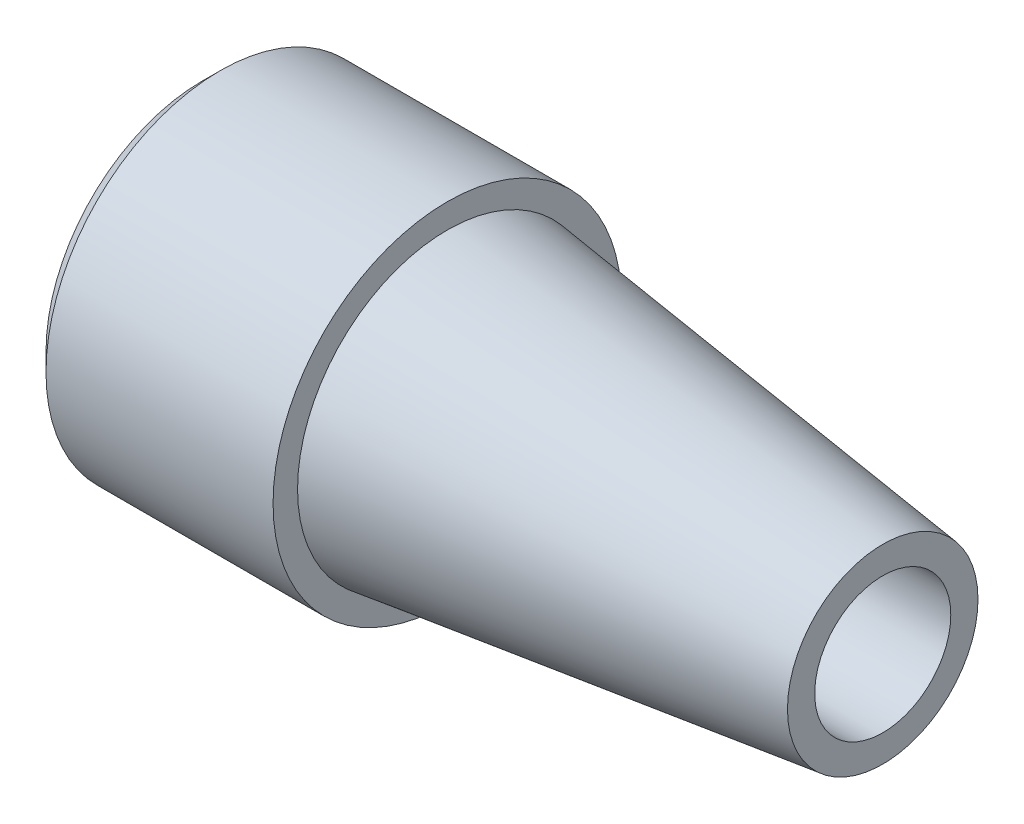
ISO-10303-21;
HEADER;
FILE_DESCRIPTION(('STEP AP214'),'2;1');
FILE_NAME('part.step','',(''),(''),'','','');
FILE_SCHEMA(('AUTOMOTIVE_DESIGN { 1 0 10303 214 1 1 1 1 }'));
ENDSEC;
DATA;
#1=APPLICATION_CONTEXT('core data for automotive mechanical design processes');
#2=APPLICATION_PROTOCOL_DEFINITION('international standard','automotive_design',2000,#1);
#3=PRODUCT_CONTEXT('',#1,'mechanical');
#4=PRODUCT('Part','Part','',(#3));
#5=PRODUCT_RELATED_PRODUCT_CATEGORY('part','',(#4));
#6=PRODUCT_DEFINITION_FORMATION('','',#4);
#7=PRODUCT_DEFINITION_CONTEXT('part definition',#1,'design');
#8=PRODUCT_DEFINITION('design','',#6,#7);
#9=PRODUCT_DEFINITION_SHAPE('','',#8);
#10=(LENGTH_UNIT() NAMED_UNIT(*) SI_UNIT(.MILLI.,.METRE.));
#11=(NAMED_UNIT(*) PLANE_ANGLE_UNIT() SI_UNIT($,.RADIAN.));
#12=(NAMED_UNIT(*) SI_UNIT($,.STERADIAN.) SOLID_ANGLE_UNIT());
#13=UNCERTAINTY_MEASURE_WITH_UNIT(LENGTH_MEASURE(1.E-05),#10,'distance_accuracy_value','');
#14=(GEOMETRIC_REPRESENTATION_CONTEXT(3) GLOBAL_UNCERTAINTY_ASSIGNED_CONTEXT((#13)) GLOBAL_UNIT_ASSIGNED_CONTEXT((#10,
#11,#12)) REPRESENTATION_CONTEXT('',''));
#15=CARTESIAN_POINT('',(0.,0.,0.));
#16=DIRECTION('',(0.,0.,1.));
#17=DIRECTION('',(1.,0.,0.));
#18=AXIS2_PLACEMENT_3D('',#15,#16,#17);
#19=CARTESIAN_POINT('',(0.,0.,0.));
#20=DIRECTION('',(-1.,0.,0.));
#21=DIRECTION('',(0.,0.,1.));
#22=AXIS2_PLACEMENT_3D('',#19,#20,#21);
#23=CONICAL_SURFACE('',#22,17.5,0.124354994546761);
#24=CARTESIAN_POINT('',(-80.,0.,0.));
#25=DIRECTION('',(-1.,0.,0.));
#26=DIRECTION('',(0.,0.,1.));
#27=AXIS2_PLACEMENT_3D('',#24,#25,#26);
#28=CIRCLE('',#27,27.5);
#29=CARTESIAN_POINT('',(-80.,0.,27.5));
#30=VERTEX_POINT('',#29);
#31=EDGE_CURVE('E63',#30,#30,#28,.T.);
#32=ORIENTED_EDGE('',*,*,#31,.F.);
#33=EDGE_LOOP('',(#32));
#34=FACE_BOUND('',#33,.T.);
#35=CARTESIAN_POINT('',(0.,0.,0.));
#36=DIRECTION('',(1.,0.,0.));
#37=DIRECTION('',(0.,0.,-1.));
#38=AXIS2_PLACEMENT_3D('',#35,#36,#37);
#39=CIRCLE('',#38,17.5);
#40=CARTESIAN_POINT('',(0.,0.,-17.5));
#41=VERTEX_POINT('',#40);
#42=EDGE_CURVE('E45',#41,#41,#39,.T.);
#43=ORIENTED_EDGE('',*,*,#42,.F.);
#44=EDGE_LOOP('',(#43));
#45=FACE_BOUND('',#44,.T.);
#46=ADVANCED_FACE('F34',(#34,#45),#23,.T.);
#47=CARTESIAN_POINT('',(0.,17.5,0.));
#48=DIRECTION('',(1.,0.,0.));
#49=DIRECTION('',(0.,0.,-1.));
#50=AXIS2_PLACEMENT_3D('',#47,#48,#49);
#51=PLANE('',#50);
#52=ORIENTED_EDGE('',*,*,#42,.T.);
#53=EDGE_LOOP('',(#52));
#54=FACE_BOUND('',#53,.T.);
#55=CARTESIAN_POINT('',(0.,0.,0.));
#56=DIRECTION('',(1.,0.,0.));
#57=DIRECTION('',(0.,0.,-1.));
#58=AXIS2_PLACEMENT_3D('',#55,#56,#57);
#59=CIRCLE('',#58,12.5);
#60=CARTESIAN_POINT('',(0.,0.,-12.5));
#61=VERTEX_POINT('',#60);
#62=EDGE_CURVE('E49',#61,#61,#59,.T.);
#63=ORIENTED_EDGE('',*,*,#62,.F.);
#64=EDGE_LOOP('',(#63));
#65=FACE_BOUND('',#64,.T.);
#66=ADVANCED_FACE('F72',(#54,#65),#51,.T.);
#67=CARTESIAN_POINT('',(0.,0.,0.));
#68=DIRECTION('',(1.,0.,0.));
#69=DIRECTION('',(0.,0.,-1.));
#70=AXIS2_PLACEMENT_3D('',#67,#68,#69);
#71=CYLINDRICAL_SURFACE('',#70,12.5);
#72=ORIENTED_EDGE('',*,*,#62,.T.);
#73=EDGE_LOOP('',(#72));
#74=FACE_BOUND('',#73,.T.);
#75=CARTESIAN_POINT('',(-77.2727272727273,0.,0.));
#76=DIRECTION('',(1.,0.,0.));
#77=DIRECTION('',(0.,0.,-1.));
#78=AXIS2_PLACEMENT_3D('',#75,#76,#77);
#79=CIRCLE('',#78,12.5);
#80=CARTESIAN_POINT('',(-77.2727272727273,0.,-12.5));
#81=VERTEX_POINT('',#80);
#82=EDGE_CURVE('E54',#81,#81,#79,.T.);
#83=ORIENTED_EDGE('',*,*,#82,.F.);
#84=EDGE_LOOP('',(#83));
#85=FACE_BOUND('',#84,.T.);
#86=ADVANCED_FACE('F77',(#74,#85),#71,.F.);
#87=CARTESIAN_POINT('',(-125.,0.,0.));
#88=DIRECTION('',(-1.,0.,0.));
#89=DIRECTION('',(0.,0.,1.));
#90=AXIS2_PLACEMENT_3D('',#87,#88,#89);
#91=CONICAL_SURFACE('',#90,25.,0.256151382565603);
#92=ORIENTED_EDGE('',*,*,#82,.T.);
#93=EDGE_LOOP('',(#92));
#94=FACE_BOUND('',#93,.T.);
#95=CARTESIAN_POINT('',(-125.,0.,0.));
#96=DIRECTION('',(1.,0.,0.));
#97=DIRECTION('',(0.,0.,-1.));
#98=AXIS2_PLACEMENT_3D('',#95,#96,#97);
#99=CIRCLE('',#98,25.);
#100=CARTESIAN_POINT('',(-125.,0.,-25.));
#101=VERTEX_POINT('',#100);
#102=EDGE_CURVE('E57',#101,#101,#99,.T.);
#103=ORIENTED_EDGE('',*,*,#102,.F.);
#104=EDGE_LOOP('',(#103));
#105=FACE_BOUND('',#104,.T.);
#106=ADVANCED_FACE('F83',(#94,#105),#91,.F.);
#107=CARTESIAN_POINT('',(-125.,27.5,0.));
#108=DIRECTION('',(-1.,0.,0.));
#109=DIRECTION('',(0.,0.,1.));
#110=AXIS2_PLACEMENT_3D('',#107,#108,#109);
#111=PLANE('',#110);
#112=CARTESIAN_POINT('',(-125.,0.,0.));
#113=DIRECTION('',(-1.,0.,0.));
#114=DIRECTION('',(0.,0.,1.));
#115=AXIS2_PLACEMENT_3D('',#112,#113,#114);
#116=CIRCLE('',#115,28.7125000000001);
#117=CARTESIAN_POINT('',(-125.,0.,28.7125000000001));
#118=VERTEX_POINT('',#117);
#119=EDGE_CURVE('E41',#118,#118,#116,.T.);
#120=ORIENTED_EDGE('',*,*,#119,.T.);
#121=EDGE_LOOP('',(#120));
#122=FACE_BOUND('',#121,.T.);
#123=ORIENTED_EDGE('',*,*,#102,.T.);
#124=EDGE_LOOP('',(#123));
#125=FACE_BOUND('',#124,.T.);
#126=ADVANCED_FACE('F89',(#122,#125),#111,.T.);
#127=CARTESIAN_POINT('',(-80.,0.,0.));
#128=DIRECTION('',(-1.,0.,0.));
#129=DIRECTION('',(0.,0.,1.));
#130=AXIS2_PLACEMENT_3D('',#127,#128,#129);
#131=CYLINDRICAL_SURFACE('',#130,32.);
#132=CARTESIAN_POINT('',(-121.7125,0.,0.));
#133=DIRECTION('',(-1.,0.,0.));
#134=DIRECTION('',(0.,0.,1.));
#135=AXIS2_PLACEMENT_3D('',#132,#133,#134);
#136=CIRCLE('',#135,32.);
#137=CARTESIAN_POINT('',(-121.7125,0.,32.));
#138=VERTEX_POINT('',#137);
#139=EDGE_CURVE('E10',#138,#138,#136,.F.);
#140=CARTESIAN_POINT('',(-80.,0.,0.));
#141=DIRECTION('',(-1.,0.,0.));
#142=DIRECTION('',(0.,0.,1.));
#143=AXIS2_PLACEMENT_3D('',#140,#141,#142);
#144=CIRCLE('',#143,32.);
#145=CARTESIAN_POINT('',(-80.,0.,32.));
#146=VERTEX_POINT('',#145);
#147=EDGE_CURVE('E60',#146,#146,#144,.T.);
#148=CARTESIAN_POINT('',(-121.7125,0.,32.));
#149=CARTESIAN_POINT('',(-121.277994791667,0.,32.));
#150=CARTESIAN_POINT('',(-120.843489583333,0.,32.));
#151=CARTESIAN_POINT('',(-119.974479166667,0.,32.));
#152=CARTESIAN_POINT('',(-119.539973958333,0.,32.));
#153=CARTESIAN_POINT('',(-118.670963541667,0.,32.));
#154=CARTESIAN_POINT('',(-118.236458333333,0.,32.));
#155=CARTESIAN_POINT('',(-117.367447916667,0.,32.));
#156=CARTESIAN_POINT('',(-116.932942708333,0.,32.));
#157=CARTESIAN_POINT('',(-116.063932291667,0.,32.));
#158=CARTESIAN_POINT('',(-115.629427083333,0.,32.));
#159=CARTESIAN_POINT('',(-114.760416666667,0.,32.));
#160=CARTESIAN_POINT('',(-114.325911458333,0.,32.));
#161=CARTESIAN_POINT('',(-113.456901041667,0.,32.));
#162=CARTESIAN_POINT('',(-113.022395833333,0.,32.));
#163=CARTESIAN_POINT('',(-112.153385416667,0.,32.));
#164=CARTESIAN_POINT('',(-111.718880208333,0.,32.));
#165=CARTESIAN_POINT('',(-110.849869791667,0.,32.));
#166=CARTESIAN_POINT('',(-110.415364583333,0.,32.));
#167=CARTESIAN_POINT('',(-109.546354166667,0.,32.));
#168=CARTESIAN_POINT('',(-109.111848958333,0.,32.));
#169=CARTESIAN_POINT('',(-108.242838541667,0.,32.));
#170=CARTESIAN_POINT('',(-107.808333333333,0.,32.));
#171=CARTESIAN_POINT('',(-106.939322916667,0.,32.));
#172=CARTESIAN_POINT('',(-106.504817708333,0.,32.));
#173=CARTESIAN_POINT('',(-105.635807291667,0.,32.));
#174=CARTESIAN_POINT('',(-105.201302083333,0.,32.));
#175=CARTESIAN_POINT('',(-104.332291666667,0.,32.));
#176=CARTESIAN_POINT('',(-103.897786458333,0.,32.));
#177=CARTESIAN_POINT('',(-103.028776041667,0.,32.));
#178=CARTESIAN_POINT('',(-102.594270833333,0.,32.));
#179=CARTESIAN_POINT('',(-101.725260416667,0.,32.));
#180=CARTESIAN_POINT('',(-101.290755208333,0.,32.));
#181=CARTESIAN_POINT('',(-100.421744791667,0.,32.));
#182=CARTESIAN_POINT('',(-99.9872395833334,0.,32.));
#183=CARTESIAN_POINT('',(-99.1182291666667,0.,32.));
#184=CARTESIAN_POINT('',(-98.6837239583334,0.,32.));
#185=CARTESIAN_POINT('',(-97.8147135416667,0.,32.));
#186=CARTESIAN_POINT('',(-97.3802083333334,0.,32.));
#187=CARTESIAN_POINT('',(-96.5111979166667,0.,32.));
#188=CARTESIAN_POINT('',(-96.0766927083334,0.,32.));
#189=CARTESIAN_POINT('',(-95.2076822916667,0.,32.));
#190=CARTESIAN_POINT('',(-94.7731770833334,0.,32.));
#191=CARTESIAN_POINT('',(-93.9041666666667,0.,32.));
#192=CARTESIAN_POINT('',(-93.4696614583334,0.,32.));
#193=CARTESIAN_POINT('',(-92.6006510416667,0.,32.));
#194=CARTESIAN_POINT('',(-92.1661458333334,0.,32.));
#195=CARTESIAN_POINT('',(-91.2971354166667,0.,32.));
#196=CARTESIAN_POINT('',(-90.8626302083334,0.,32.));
#197=CARTESIAN_POINT('',(-89.9936197916667,0.,32.));
#198=CARTESIAN_POINT('',(-89.5591145833334,0.,32.));
#199=CARTESIAN_POINT('',(-88.6901041666667,0.,32.));
#200=CARTESIAN_POINT('',(-88.2555989583334,0.,32.));
#201=CARTESIAN_POINT('',(-87.3865885416667,0.,32.));
#202=CARTESIAN_POINT('',(-86.9520833333333,0.,32.));
#203=CARTESIAN_POINT('',(-86.0830729166667,0.,32.));
#204=CARTESIAN_POINT('',(-85.6485677083333,0.,32.));
#205=CARTESIAN_POINT('',(-84.7795572916667,0.,32.));
#206=CARTESIAN_POINT('',(-84.3450520833333,0.,32.));
#207=CARTESIAN_POINT('',(-83.4760416666667,0.,32.));
#208=CARTESIAN_POINT('',(-83.0415364583333,0.,32.));
#209=CARTESIAN_POINT('',(-82.1725260416667,0.,32.));
#210=CARTESIAN_POINT('',(-81.7380208333333,0.,32.));
#211=CARTESIAN_POINT('',(-80.8690104166667,0.,32.));
#212=CARTESIAN_POINT('',(-80.4345052083333,0.,32.));
#213=CARTESIAN_POINT('',(-80.,0.,32.));
#214=B_SPLINE_CURVE_WITH_KNOTS('',3,(#148,#149,#150,#151,#152,#153,#154,#155,#156,#157,#158,
#159,#160,#161,#162,#163,#164,#165,#166,#167,#168,#169,#170,#171,#172,#173,#174,#175,#176,#177,
#178,#179,#180,#181,#182,#183,#184,#185,#186,#187,#188,#189,#190,#191,#192,#193,#194,#195,#196,
#197,#198,#199,#200,#201,#202,#203,#204,#205,#206,#207,#208,#209,#210,#211,#212,#213),
.UNSPECIFIED.,.F.,.F.,(4,2,2,2,2,2,2,2,2,2,2,2,2,2,2,2,2,2,2,2,2,2,2,2,2,2,2,2,2,2,2,2,4),(0.,
1.303515625,2.60703125,3.910546875,5.21406250000001,6.51757812500001,7.82109375000001,
9.12460937500001,10.428125,11.731640625,13.03515625,14.338671875,15.6421875,16.945703125,
18.24921875,19.552734375,20.85625,22.159765625,23.46328125,24.766796875,26.0703125,27.373828125,
28.67734375,29.980859375,31.284375,32.587890625,33.89140625,35.194921875,36.4984375000001,
37.8019531250001,39.10546875,40.4089843750001,41.7125),.UNSPECIFIED.);
#215=EDGE_CURVE('BSEAM94',#138,#146,#214,.T.);
#216=ORIENTED_EDGE('',*,*,#139,.T.);
#217=ORIENTED_EDGE('',*,*,#147,.T.);
#218=ORIENTED_EDGE('',*,*,#215,.T.);
#219=ORIENTED_EDGE('',*,*,#215,.F.);
#220=EDGE_LOOP('',(#216,#218,#217,#219));
#221=FACE_BOUND('',#220,.T.);
#222=ADVANCED_FACE('F94',(#221),#131,.T.);
#223=CARTESIAN_POINT('',(-80.,0.,0.));
#224=DIRECTION('',(-1.,0.,0.));
#225=DIRECTION('',(0.,0.,1.));
#226=AXIS2_PLACEMENT_3D('',#223,#224,#225);
#227=PLANE('',#226);
#228=ORIENTED_EDGE('',*,*,#31,.T.);
#229=EDGE_LOOP('',(#228));
#230=FACE_BOUND('',#229,.T.);
#231=ORIENTED_EDGE('',*,*,#147,.F.);
#232=EDGE_LOOP('',(#231));
#233=FACE_BOUND('',#232,.T.);
#234=ADVANCED_FACE('F67',(#230,#233),#227,.F.);
#235=CARTESIAN_POINT('',(-125.,0.,0.));
#236=DIRECTION('',(1.,0.,0.));
#237=DIRECTION('',(0.,0.,-1.));
#238=AXIS2_PLACEMENT_3D('',#235,#236,#237);
#239=CONICAL_SURFACE('',#238,28.7125000000001,0.785398163397447);
#240=ORIENTED_EDGE('',*,*,#139,.F.);
#241=EDGE_LOOP('',(#240));
#242=FACE_BOUND('',#241,.T.);
#243=ORIENTED_EDGE('',*,*,#119,.F.);
#244=EDGE_LOOP('',(#243));
#245=FACE_BOUND('',#244,.T.);
#246=ADVANCED_FACE('F36',(#242,#245),#239,.T.);
#247=CLOSED_SHELL('',(#46,#66,#86,#106,#126,#222,#234,#246));
#248=MANIFOLD_SOLID_BREP('B2',#247);
#249=ADVANCED_BREP_SHAPE_REPRESENTATION('',(#18,#248),#14);
#250=SHAPE_DEFINITION_REPRESENTATION(#9,#249);
ENDSEC;
END-ISO-10303-21;
